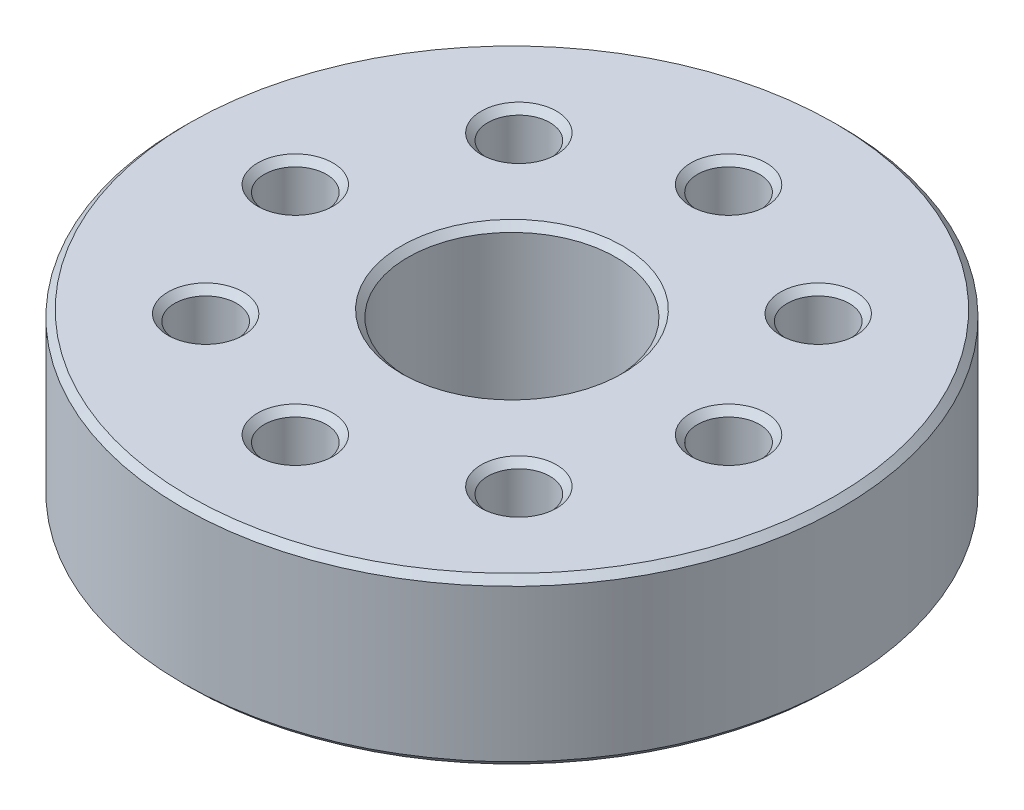
ISO-10303-21;
HEADER;
FILE_DESCRIPTION(('STEP AP214'),'2;1');
FILE_NAME('part.step','',(''),(''),'','','');
FILE_SCHEMA(('AUTOMOTIVE_DESIGN { 1 0 10303 214 1 1 1 1 }'));
ENDSEC;
DATA;
#1=APPLICATION_CONTEXT('core data for automotive mechanical design processes');
#2=APPLICATION_PROTOCOL_DEFINITION('international standard','automotive_design',2000,#1);
#3=PRODUCT_CONTEXT('',#1,'mechanical');
#4=PRODUCT('Part','Part','',(#3));
#5=PRODUCT_RELATED_PRODUCT_CATEGORY('part','',(#4));
#6=PRODUCT_DEFINITION_FORMATION('','',#4);
#7=PRODUCT_DEFINITION_CONTEXT('part definition',#1,'design');
#8=PRODUCT_DEFINITION('design','',#6,#7);
#9=PRODUCT_DEFINITION_SHAPE('','',#8);
#10=(LENGTH_UNIT() NAMED_UNIT(*) SI_UNIT(.MILLI.,.METRE.));
#11=(NAMED_UNIT(*) PLANE_ANGLE_UNIT() SI_UNIT($,.RADIAN.));
#12=(NAMED_UNIT(*) SI_UNIT($,.STERADIAN.) SOLID_ANGLE_UNIT());
#13=UNCERTAINTY_MEASURE_WITH_UNIT(LENGTH_MEASURE(1.E-05),#10,'distance_accuracy_value','');
#14=(GEOMETRIC_REPRESENTATION_CONTEXT(3) GLOBAL_UNCERTAINTY_ASSIGNED_CONTEXT((#13)) GLOBAL_UNIT_ASSIGNED_CONTEXT((#10,
#11,#12)) REPRESENTATION_CONTEXT('',''));
#15=CARTESIAN_POINT('',(0.,0.,0.));
#16=DIRECTION('',(0.,0.,1.));
#17=DIRECTION('',(1.,0.,0.));
#18=AXIS2_PLACEMENT_3D('',#15,#16,#17);
#19=CARTESIAN_POINT('',(0.,6.35,0.));
#20=DIRECTION('',(0.,1.,0.));
#21=DIRECTION('',(0.,0.,1.));
#22=AXIS2_PLACEMENT_3D('',#19,#20,#21);
#23=PLANE('',#22);
#24=CARTESIAN_POINT('',(0.,6.35,0.));
#25=DIRECTION('',(0.,1.,0.));
#26=DIRECTION('',(0.,0.,1.));
#27=AXIS2_PLACEMENT_3D('',#24,#25,#26);
#28=CIRCLE('',#27,4.2545);
#29=CARTESIAN_POINT('',(0.,6.35,4.2545));
#30=VERTEX_POINT('',#29);
#31=EDGE_CURVE('E126',#30,#30,#28,.F.);
#32=ORIENTED_EDGE('',*,*,#31,.T.);
#33=EDGE_LOOP('',(#32));
#34=FACE_BOUND('',#33,.T.);
#35=CARTESIAN_POINT('',(6.02278841453923,6.35,-5.75629335194898));
#36=DIRECTION('',(0.,1.,0.));
#37=DIRECTION('',(0.,0.,1.));
#38=AXIS2_PLACEMENT_3D('',#35,#36,#37);
#39=CIRCLE('',#38,1.4478);
#40=CARTESIAN_POINT('',(6.02278841453923,6.35,-4.30849335194898));
#41=VERTEX_POINT('',#40);
#42=EDGE_CURVE('E129',#41,#41,#39,.F.);
#43=ORIENTED_EDGE('',*,*,#42,.T.);
#44=EDGE_LOOP('',(#43));
#45=FACE_BOUND('',#44,.T.);
#46=CARTESIAN_POINT('',(8.3312,6.35,0.));
#47=DIRECTION('',(0.,1.,0.));
#48=DIRECTION('',(0.,0.,1.));
#49=AXIS2_PLACEMENT_3D('',#46,#47,#48);
#50=CIRCLE('',#49,1.4478);
#51=CARTESIAN_POINT('',(8.3312,6.35,1.4478));
#52=VERTEX_POINT('',#51);
#53=EDGE_CURVE('E132',#52,#52,#50,.F.);
#54=ORIENTED_EDGE('',*,*,#53,.T.);
#55=EDGE_LOOP('',(#54));
#56=FACE_BOUND('',#55,.T.);
#57=CARTESIAN_POINT('',(6.02278841453924,6.35,5.75629335194898));
#58=DIRECTION('',(0.,1.,0.));
#59=DIRECTION('',(0.,0.,1.));
#60=AXIS2_PLACEMENT_3D('',#57,#58,#59);
#61=CIRCLE('',#60,1.4478);
#62=CARTESIAN_POINT('',(6.02278841453924,6.35,7.20409335194897));
#63=VERTEX_POINT('',#62);
#64=EDGE_CURVE('E135',#63,#63,#61,.F.);
#65=ORIENTED_EDGE('',*,*,#64,.T.);
#66=EDGE_LOOP('',(#65));
#67=FACE_BOUND('',#66,.T.);
#68=CARTESIAN_POINT('',(0.,6.35,8.3312));
#69=DIRECTION('',(0.,1.,0.));
#70=DIRECTION('',(0.,0.,1.));
#71=AXIS2_PLACEMENT_3D('',#68,#69,#70);
#72=CIRCLE('',#71,1.4478);
#73=CARTESIAN_POINT('',(0.,6.35,9.779));
#74=VERTEX_POINT('',#73);
#75=EDGE_CURVE('E138',#74,#74,#72,.F.);
#76=ORIENTED_EDGE('',*,*,#75,.T.);
#77=EDGE_LOOP('',(#76));
#78=FACE_BOUND('',#77,.T.);
#79=CARTESIAN_POINT('',(-5.756293351949,6.35,6.02278841453921));
#80=DIRECTION('',(0.,1.,0.));
#81=DIRECTION('',(0.,0.,1.));
#82=AXIS2_PLACEMENT_3D('',#79,#80,#81);
#83=CIRCLE('',#82,1.4478);
#84=CARTESIAN_POINT('',(-5.756293351949,6.35,7.47058841453921));
#85=VERTEX_POINT('',#84);
#86=EDGE_CURVE('E141',#85,#85,#83,.F.);
#87=ORIENTED_EDGE('',*,*,#86,.T.);
#88=EDGE_LOOP('',(#87));
#89=FACE_BOUND('',#88,.T.);
#90=CARTESIAN_POINT('',(-8.3312,6.35,0.));
#91=DIRECTION('',(0.,1.,0.));
#92=DIRECTION('',(0.,0.,1.));
#93=AXIS2_PLACEMENT_3D('',#90,#91,#92);
#94=CIRCLE('',#93,1.4478);
#95=CARTESIAN_POINT('',(-8.3312,6.35,1.4478));
#96=VERTEX_POINT('',#95);
#97=EDGE_CURVE('E144',#96,#96,#94,.F.);
#98=ORIENTED_EDGE('',*,*,#97,.T.);
#99=EDGE_LOOP('',(#98));
#100=FACE_BOUND('',#99,.T.);
#101=CARTESIAN_POINT('',(-5.756293351949,6.35,-6.02278841453921));
#102=DIRECTION('',(0.,1.,0.));
#103=DIRECTION('',(0.,0.,1.));
#104=AXIS2_PLACEMENT_3D('',#101,#102,#103);
#105=CIRCLE('',#104,1.4478);
#106=CARTESIAN_POINT('',(-5.756293351949,6.35,-4.57498841453921));
#107=VERTEX_POINT('',#106);
#108=EDGE_CURVE('E147',#107,#107,#105,.F.);
#109=ORIENTED_EDGE('',*,*,#108,.T.);
#110=EDGE_LOOP('',(#109));
#111=FACE_BOUND('',#110,.T.);
#112=CARTESIAN_POINT('',(0.,6.35,-8.3312));
#113=DIRECTION('',(0.,1.,0.));
#114=DIRECTION('',(0.,0.,1.));
#115=AXIS2_PLACEMENT_3D('',#112,#113,#114);
#116=CIRCLE('',#115,1.4478);
#117=CARTESIAN_POINT('',(0.,6.35,-6.8834));
#118=VERTEX_POINT('',#117);
#119=EDGE_CURVE('E150',#118,#118,#116,.F.);
#120=ORIENTED_EDGE('',*,*,#119,.T.);
#121=EDGE_LOOP('',(#120));
#122=FACE_BOUND('',#121,.T.);
#123=CARTESIAN_POINT('',(0.,6.35,0.));
#124=DIRECTION('',(0.,1.,0.));
#125=DIRECTION('',(0.,0.,1.));
#126=AXIS2_PLACEMENT_3D('',#123,#124,#125);
#127=CIRCLE('',#126,12.4206);
#128=CARTESIAN_POINT('',(0.,6.35,12.4206));
#129=VERTEX_POINT('',#128);
#130=EDGE_CURVE('E153',#129,#129,#127,.T.);
#131=ORIENTED_EDGE('',*,*,#130,.T.);
#132=EDGE_LOOP('',(#131));
#133=FACE_BOUND('',#132,.T.);
#134=ADVANCED_FACE('F34',(#34,#45,#56,#67,#78,#89,#100,#111,#122,#133),#23,.T.);
#135=CARTESIAN_POINT('',(0.,0.,0.));
#136=DIRECTION('',(0.,1.,0.));
#137=DIRECTION('',(0.,0.,1.));
#138=AXIS2_PLACEMENT_3D('',#135,#136,#137);
#139=PLANE('',#138);
#140=CARTESIAN_POINT('',(-8.3312,0.,0.));
#141=DIRECTION('',(0.,1.,0.));
#142=DIRECTION('',(0.,0.,1.));
#143=AXIS2_PLACEMENT_3D('',#140,#141,#142);
#144=CIRCLE('',#143,1.4478);
#145=CARTESIAN_POINT('',(-8.3312,0.,1.4478));
#146=VERTEX_POINT('',#145);
#147=EDGE_CURVE('E10',#146,#146,#144,.T.);
#148=ORIENTED_EDGE('',*,*,#147,.T.);
#149=EDGE_LOOP('',(#148));
#150=FACE_BOUND('',#149,.T.);
#151=CARTESIAN_POINT('',(-5.756293351949,0.,-6.02278841453921));
#152=DIRECTION('',(0.,1.,0.));
#153=DIRECTION('',(0.,0.,1.));
#154=AXIS2_PLACEMENT_3D('',#151,#152,#153);
#155=CIRCLE('',#154,1.4478);
#156=CARTESIAN_POINT('',(-5.756293351949,0.,-4.57498841453921));
#157=VERTEX_POINT('',#156);
#158=EDGE_CURVE('E41',#157,#157,#155,.T.);
#159=ORIENTED_EDGE('',*,*,#158,.T.);
#160=EDGE_LOOP('',(#159));
#161=FACE_BOUND('',#160,.T.);
#162=CARTESIAN_POINT('',(0.,0.,-8.3312));
#163=DIRECTION('',(0.,1.,0.));
#164=DIRECTION('',(0.,0.,1.));
#165=AXIS2_PLACEMENT_3D('',#162,#163,#164);
#166=CIRCLE('',#165,1.44780000000001);
#167=CARTESIAN_POINT('',(0.,0.,-6.88339999999999));
#168=VERTEX_POINT('',#167);
#169=EDGE_CURVE('E45',#168,#168,#166,.T.);
#170=ORIENTED_EDGE('',*,*,#169,.T.);
#171=EDGE_LOOP('',(#170));
#172=FACE_BOUND('',#171,.T.);
#173=CARTESIAN_POINT('',(6.02278841453923,0.,-5.75629335194898));
#174=DIRECTION('',(0.,1.,0.));
#175=DIRECTION('',(0.,0.,1.));
#176=AXIS2_PLACEMENT_3D('',#173,#174,#175);
#177=CIRCLE('',#176,1.4478);
#178=CARTESIAN_POINT('',(6.02278841453923,0.,-4.30849335194898));
#179=VERTEX_POINT('',#178);
#180=EDGE_CURVE('E49',#179,#179,#177,.T.);
#181=ORIENTED_EDGE('',*,*,#180,.T.);
#182=EDGE_LOOP('',(#181));
#183=FACE_BOUND('',#182,.T.);
#184=CARTESIAN_POINT('',(8.3312,0.,0.));
#185=DIRECTION('',(0.,1.,0.));
#186=DIRECTION('',(0.,0.,1.));
#187=AXIS2_PLACEMENT_3D('',#184,#185,#186);
#188=CIRCLE('',#187,1.4478);
#189=CARTESIAN_POINT('',(8.3312,0.,1.4478));
#190=VERTEX_POINT('',#189);
#191=EDGE_CURVE('E54',#190,#190,#188,.T.);
#192=ORIENTED_EDGE('',*,*,#191,.T.);
#193=EDGE_LOOP('',(#192));
#194=FACE_BOUND('',#193,.T.);
#195=CARTESIAN_POINT('',(6.02278841453924,0.,5.75629335194898));
#196=DIRECTION('',(0.,1.,0.));
#197=DIRECTION('',(0.,0.,1.));
#198=AXIS2_PLACEMENT_3D('',#195,#196,#197);
#199=CIRCLE('',#198,1.44779999999999);
#200=CARTESIAN_POINT('',(6.02278841453924,0.,7.20409335194897));
#201=VERTEX_POINT('',#200);
#202=EDGE_CURVE('E57',#201,#201,#199,.T.);
#203=ORIENTED_EDGE('',*,*,#202,.T.);
#204=EDGE_LOOP('',(#203));
#205=FACE_BOUND('',#204,.T.);
#206=CARTESIAN_POINT('',(0.,0.,8.3312));
#207=DIRECTION('',(0.,1.,0.));
#208=DIRECTION('',(0.,0.,1.));
#209=AXIS2_PLACEMENT_3D('',#206,#207,#208);
#210=CIRCLE('',#209,1.4478);
#211=CARTESIAN_POINT('',(0.,0.,9.779));
#212=VERTEX_POINT('',#211);
#213=EDGE_CURVE('E60',#212,#212,#210,.T.);
#214=ORIENTED_EDGE('',*,*,#213,.T.);
#215=EDGE_LOOP('',(#214));
#216=FACE_BOUND('',#215,.T.);
#217=CARTESIAN_POINT('',(-5.756293351949,0.,6.02278841453921));
#218=DIRECTION('',(0.,1.,0.));
#219=DIRECTION('',(0.,0.,1.));
#220=AXIS2_PLACEMENT_3D('',#217,#218,#219);
#221=CIRCLE('',#220,1.4478);
#222=CARTESIAN_POINT('',(-5.756293351949,0.,7.47058841453921));
#223=VERTEX_POINT('',#222);
#224=EDGE_CURVE('E63',#223,#223,#221,.T.);
#225=ORIENTED_EDGE('',*,*,#224,.T.);
#226=EDGE_LOOP('',(#225));
#227=FACE_BOUND('',#226,.T.);
#228=CARTESIAN_POINT('',(0.,0.,0.));
#229=DIRECTION('',(0.,1.,0.));
#230=DIRECTION('',(0.,0.,1.));
#231=AXIS2_PLACEMENT_3D('',#228,#229,#230);
#232=CIRCLE('',#231,12.4206);
#233=CARTESIAN_POINT('',(0.,0.,12.4206));
#234=VERTEX_POINT('',#233);
#235=EDGE_CURVE('E66',#234,#234,#232,.F.);
#236=ORIENTED_EDGE('',*,*,#235,.T.);
#237=EDGE_LOOP('',(#236));
#238=FACE_BOUND('',#237,.T.);
#239=CARTESIAN_POINT('',(0.,0.,0.));
#240=DIRECTION('',(0.,1.,0.));
#241=DIRECTION('',(0.,0.,1.));
#242=AXIS2_PLACEMENT_3D('',#239,#240,#241);
#243=CIRCLE('',#242,4.2545);
#244=CARTESIAN_POINT('',(0.,0.,4.2545));
#245=VERTEX_POINT('',#244);
#246=EDGE_CURVE('E69',#245,#245,#243,.T.);
#247=ORIENTED_EDGE('',*,*,#246,.T.);
#248=EDGE_LOOP('',(#247));
#249=FACE_BOUND('',#248,.T.);
#250=ADVANCED_FACE('F170',(#150,#161,#172,#183,#194,#205,#216,#227,#238,#249),#139,.F.);
#251=CARTESIAN_POINT('',(0.,6.35,0.));
#252=DIRECTION('',(0.,-1.,0.));
#253=DIRECTION('',(0.,0.,-1.));
#254=AXIS2_PLACEMENT_3D('',#251,#252,#253);
#255=CYLINDRICAL_SURFACE('',#254,12.6746);
#256=CARTESIAN_POINT('',(0.,6.09599999999999,0.));
#257=DIRECTION('',(0.,1.,0.));
#258=DIRECTION('',(0.,0.,1.));
#259=AXIS2_PLACEMENT_3D('',#256,#257,#258);
#260=CIRCLE('',#259,12.6746);
#261=CARTESIAN_POINT('',(0.,6.09599999999999,12.6746));
#262=VERTEX_POINT('',#261);
#263=EDGE_CURVE('E72',#262,#262,#260,.F.);
#264=ORIENTED_EDGE('',*,*,#263,.T.);
#265=EDGE_LOOP('',(#264));
#266=FACE_BOUND('',#265,.T.);
#267=CARTESIAN_POINT('',(0.,0.253999999999992,0.));
#268=DIRECTION('',(0.,1.,0.));
#269=DIRECTION('',(0.,0.,1.));
#270=AXIS2_PLACEMENT_3D('',#267,#268,#269);
#271=CIRCLE('',#270,12.6746);
#272=CARTESIAN_POINT('',(0.,0.253999999999992,12.6746));
#273=VERTEX_POINT('',#272);
#274=EDGE_CURVE('E75',#273,#273,#271,.T.);
#275=ORIENTED_EDGE('',*,*,#274,.T.);
#276=EDGE_LOOP('',(#275));
#277=FACE_BOUND('',#276,.T.);
#278=ADVANCED_FACE('F172',(#266,#277),#255,.T.);
#279=CARTESIAN_POINT('',(0.,6.35,0.));
#280=DIRECTION('',(0.,-1.,0.));
#281=DIRECTION('',(0.,0.,-1.));
#282=AXIS2_PLACEMENT_3D('',#279,#280,#281);
#283=CYLINDRICAL_SURFACE('',#282,4.0005);
#284=CARTESIAN_POINT('',(0.,6.096,0.));
#285=DIRECTION('',(0.,1.,0.));
#286=DIRECTION('',(0.,0.,1.));
#287=AXIS2_PLACEMENT_3D('',#284,#285,#286);
#288=CIRCLE('',#287,4.0005);
#289=CARTESIAN_POINT('',(0.,6.096,4.0005));
#290=VERTEX_POINT('',#289);
#291=EDGE_CURVE('E156',#290,#290,#288,.T.);
#292=ORIENTED_EDGE('',*,*,#291,.T.);
#293=EDGE_LOOP('',(#292));
#294=FACE_BOUND('',#293,.T.);
#295=CARTESIAN_POINT('',(0.,0.254000000000003,0.));
#296=DIRECTION('',(0.,1.,0.));
#297=DIRECTION('',(0.,0.,1.));
#298=AXIS2_PLACEMENT_3D('',#295,#296,#297);
#299=CIRCLE('',#298,4.0005);
#300=CARTESIAN_POINT('',(0.,0.254000000000003,4.0005));
#301=VERTEX_POINT('',#300);
#302=EDGE_CURVE('E159',#301,#301,#299,.F.);
#303=ORIENTED_EDGE('',*,*,#302,.T.);
#304=EDGE_LOOP('',(#303));
#305=FACE_BOUND('',#304,.T.);
#306=ADVANCED_FACE('F163',(#294,#305),#283,.F.);
#307=CARTESIAN_POINT('',(0.,6.35,-8.3312));
#308=DIRECTION('',(0.,-1.,0.));
#309=DIRECTION('',(0.,0.,-1.));
#310=AXIS2_PLACEMENT_3D('',#307,#308,#309);
#311=CYLINDRICAL_SURFACE('',#310,1.1938);
#312=CARTESIAN_POINT('',(0.,6.096,-8.3312));
#313=DIRECTION('',(0.,1.,0.));
#314=DIRECTION('',(0.,0.,1.));
#315=AXIS2_PLACEMENT_3D('',#312,#313,#314);
#316=CIRCLE('',#315,1.1938);
#317=CARTESIAN_POINT('',(0.,6.096,-7.1374));
#318=VERTEX_POINT('',#317);
#319=EDGE_CURVE('E78',#318,#318,#316,.T.);
#320=ORIENTED_EDGE('',*,*,#319,.T.);
#321=EDGE_LOOP('',(#320));
#322=FACE_BOUND('',#321,.T.);
#323=CARTESIAN_POINT('',(0.,0.254000000000011,-8.3312));
#324=DIRECTION('',(0.,1.,0.));
#325=DIRECTION('',(0.,0.,1.));
#326=AXIS2_PLACEMENT_3D('',#323,#324,#325);
#327=CIRCLE('',#326,1.1938);
#328=CARTESIAN_POINT('',(0.,0.254000000000011,-7.1374));
#329=VERTEX_POINT('',#328);
#330=EDGE_CURVE('E81',#329,#329,#327,.F.);
#331=ORIENTED_EDGE('',*,*,#330,.T.);
#332=EDGE_LOOP('',(#331));
#333=FACE_BOUND('',#332,.T.);
#334=ADVANCED_FACE('F426',(#322,#333),#311,.F.);
#335=CARTESIAN_POINT('',(8.3312,6.35,0.));
#336=DIRECTION('',(0.,-1.,0.));
#337=DIRECTION('',(0.,0.,-1.));
#338=AXIS2_PLACEMENT_3D('',#335,#336,#337);
#339=CYLINDRICAL_SURFACE('',#338,1.1938);
#340=CARTESIAN_POINT('',(8.3312,6.096,0.));
#341=DIRECTION('',(0.,1.,0.));
#342=DIRECTION('',(0.,0.,1.));
#343=AXIS2_PLACEMENT_3D('',#340,#341,#342);
#344=CIRCLE('',#343,1.1938);
#345=CARTESIAN_POINT('',(8.3312,6.096,1.1938));
#346=VERTEX_POINT('',#345);
#347=EDGE_CURVE('E114',#346,#346,#344,.T.);
#348=ORIENTED_EDGE('',*,*,#347,.T.);
#349=EDGE_LOOP('',(#348));
#350=FACE_BOUND('',#349,.T.);
#351=CARTESIAN_POINT('',(8.3312,0.253999999999999,0.));
#352=DIRECTION('',(0.,1.,0.));
#353=DIRECTION('',(0.,0.,1.));
#354=AXIS2_PLACEMENT_3D('',#351,#352,#353);
#355=CIRCLE('',#354,1.1938);
#356=CARTESIAN_POINT('',(8.3312,0.253999999999999,1.1938));
#357=VERTEX_POINT('',#356);
#358=EDGE_CURVE('E117',#357,#357,#355,.F.);
#359=ORIENTED_EDGE('',*,*,#358,.T.);
#360=EDGE_LOOP('',(#359));
#361=FACE_BOUND('',#360,.T.);
#362=ADVANCED_FACE('F417',(#350,#361),#339,.F.);
#363=CARTESIAN_POINT('',(0.,6.35,8.3312));
#364=DIRECTION('',(0.,-1.,0.));
#365=DIRECTION('',(0.,0.,-1.));
#366=AXIS2_PLACEMENT_3D('',#363,#364,#365);
#367=CYLINDRICAL_SURFACE('',#366,1.1938);
#368=CARTESIAN_POINT('',(0.,6.096,8.3312));
#369=DIRECTION('',(0.,1.,0.));
#370=DIRECTION('',(0.,0.,1.));
#371=AXIS2_PLACEMENT_3D('',#368,#369,#370);
#372=CIRCLE('',#371,1.1938);
#373=CARTESIAN_POINT('',(0.,6.096,9.525));
#374=VERTEX_POINT('',#373);
#375=EDGE_CURVE('E102',#374,#374,#372,.T.);
#376=ORIENTED_EDGE('',*,*,#375,.T.);
#377=EDGE_LOOP('',(#376));
#378=FACE_BOUND('',#377,.T.);
#379=CARTESIAN_POINT('',(0.,0.253999999999999,8.3312));
#380=DIRECTION('',(0.,1.,0.));
#381=DIRECTION('',(0.,0.,1.));
#382=AXIS2_PLACEMENT_3D('',#379,#380,#381);
#383=CIRCLE('',#382,1.1938);
#384=CARTESIAN_POINT('',(0.,0.253999999999999,9.525));
#385=VERTEX_POINT('',#384);
#386=EDGE_CURVE('E105',#385,#385,#383,.F.);
#387=ORIENTED_EDGE('',*,*,#386,.T.);
#388=EDGE_LOOP('',(#387));
#389=FACE_BOUND('',#388,.T.);
#390=ADVANCED_FACE('F408',(#378,#389),#367,.F.);
#391=CARTESIAN_POINT('',(-8.3312,6.35,0.));
#392=DIRECTION('',(0.,-1.,0.));
#393=DIRECTION('',(0.,0.,-1.));
#394=AXIS2_PLACEMENT_3D('',#391,#392,#393);
#395=CYLINDRICAL_SURFACE('',#394,1.1938);
#396=CARTESIAN_POINT('',(-8.3312,6.096,0.));
#397=DIRECTION('',(0.,1.,0.));
#398=DIRECTION('',(0.,0.,1.));
#399=AXIS2_PLACEMENT_3D('',#396,#397,#398);
#400=CIRCLE('',#399,1.1938);
#401=CARTESIAN_POINT('',(-8.3312,6.096,1.1938));
#402=VERTEX_POINT('',#401);
#403=EDGE_CURVE('E90',#402,#402,#400,.T.);
#404=ORIENTED_EDGE('',*,*,#403,.T.);
#405=EDGE_LOOP('',(#404));
#406=FACE_BOUND('',#405,.T.);
#407=CARTESIAN_POINT('',(-8.3312,0.253999999999999,0.));
#408=DIRECTION('',(0.,1.,0.));
#409=DIRECTION('',(0.,0.,1.));
#410=AXIS2_PLACEMENT_3D('',#407,#408,#409);
#411=CIRCLE('',#410,1.1938);
#412=CARTESIAN_POINT('',(-8.3312,0.253999999999999,1.1938));
#413=VERTEX_POINT('',#412);
#414=EDGE_CURVE('E93',#413,#413,#411,.F.);
#415=ORIENTED_EDGE('',*,*,#414,.T.);
#416=EDGE_LOOP('',(#415));
#417=FACE_BOUND('',#416,.T.);
#418=ADVANCED_FACE('F399',(#406,#417),#395,.F.);
#419=CARTESIAN_POINT('',(-5.756293351949,6.35,-6.02278841453921));
#420=DIRECTION('',(0.,-1.,0.));
#421=DIRECTION('',(0.,0.,-1.));
#422=AXIS2_PLACEMENT_3D('',#419,#420,#421);
#423=CYLINDRICAL_SURFACE('',#422,1.1938);
#424=CARTESIAN_POINT('',(-5.756293351949,6.096,-6.02278841453921));
#425=DIRECTION('',(0.,1.,0.));
#426=DIRECTION('',(0.,0.,1.));
#427=AXIS2_PLACEMENT_3D('',#424,#425,#426);
#428=CIRCLE('',#427,1.1938);
#429=CARTESIAN_POINT('',(-5.756293351949,6.096,-4.82898841453921));
#430=VERTEX_POINT('',#429);
#431=EDGE_CURVE('E84',#430,#430,#428,.T.);
#432=ORIENTED_EDGE('',*,*,#431,.T.);
#433=EDGE_LOOP('',(#432));
#434=FACE_BOUND('',#433,.T.);
#435=CARTESIAN_POINT('',(-5.756293351949,0.253999999999999,-6.02278841453921));
#436=DIRECTION('',(0.,1.,0.));
#437=DIRECTION('',(0.,0.,1.));
#438=AXIS2_PLACEMENT_3D('',#435,#436,#437);
#439=CIRCLE('',#438,1.1938);
#440=CARTESIAN_POINT('',(-5.756293351949,0.253999999999999,-4.82898841453921));
#441=VERTEX_POINT('',#440);
#442=EDGE_CURVE('E87',#441,#441,#439,.F.);
#443=ORIENTED_EDGE('',*,*,#442,.T.);
#444=EDGE_LOOP('',(#443));
#445=FACE_BOUND('',#444,.T.);
#446=ADVANCED_FACE('F390',(#434,#445),#423,.F.);
#447=CARTESIAN_POINT('',(6.02278841453923,6.35,-5.75629335194898));
#448=DIRECTION('',(0.,-1.,0.));
#449=DIRECTION('',(0.,0.,-1.));
#450=AXIS2_PLACEMENT_3D('',#447,#448,#449);
#451=CYLINDRICAL_SURFACE('',#450,1.1938);
#452=CARTESIAN_POINT('',(6.02278841453923,6.096,-5.75629335194898));
#453=DIRECTION('',(0.,1.,0.));
#454=DIRECTION('',(0.,0.,1.));
#455=AXIS2_PLACEMENT_3D('',#452,#453,#454);
#456=CIRCLE('',#455,1.1938);
#457=CARTESIAN_POINT('',(6.02278841453923,6.096,-4.56249335194898));
#458=VERTEX_POINT('',#457);
#459=EDGE_CURVE('E120',#458,#458,#456,.T.);
#460=ORIENTED_EDGE('',*,*,#459,.T.);
#461=EDGE_LOOP('',(#460));
#462=FACE_BOUND('',#461,.T.);
#463=CARTESIAN_POINT('',(6.02278841453923,0.253999999999999,-5.75629335194898));
#464=DIRECTION('',(0.,1.,0.));
#465=DIRECTION('',(0.,0.,1.));
#466=AXIS2_PLACEMENT_3D('',#463,#464,#465);
#467=CIRCLE('',#466,1.1938);
#468=CARTESIAN_POINT('',(6.02278841453923,0.253999999999999,-4.56249335194898));
#469=VERTEX_POINT('',#468);
#470=EDGE_CURVE('E123',#469,#469,#467,.F.);
#471=ORIENTED_EDGE('',*,*,#470,.T.);
#472=EDGE_LOOP('',(#471));
#473=FACE_BOUND('',#472,.T.);
#474=ADVANCED_FACE('F381',(#462,#473),#451,.F.);
#475=CARTESIAN_POINT('',(6.02278841453924,6.35,5.75629335194898));
#476=DIRECTION('',(0.,-1.,0.));
#477=DIRECTION('',(0.,0.,-1.));
#478=AXIS2_PLACEMENT_3D('',#475,#476,#477);
#479=CYLINDRICAL_SURFACE('',#478,1.1938);
#480=CARTESIAN_POINT('',(6.02278841453924,6.096,5.75629335194898));
#481=DIRECTION('',(0.,1.,0.));
#482=DIRECTION('',(0.,0.,1.));
#483=AXIS2_PLACEMENT_3D('',#480,#481,#482);
#484=CIRCLE('',#483,1.1938);
#485=CARTESIAN_POINT('',(6.02278841453924,6.096,6.95009335194897));
#486=VERTEX_POINT('',#485);
#487=EDGE_CURVE('E108',#486,#486,#484,.T.);
#488=ORIENTED_EDGE('',*,*,#487,.T.);
#489=EDGE_LOOP('',(#488));
#490=FACE_BOUND('',#489,.T.);
#491=CARTESIAN_POINT('',(6.02278841453924,0.253999999999996,5.75629335194898));
#492=DIRECTION('',(0.,1.,0.));
#493=DIRECTION('',(0.,0.,1.));
#494=AXIS2_PLACEMENT_3D('',#491,#492,#493);
#495=CIRCLE('',#494,1.1938);
#496=CARTESIAN_POINT('',(6.02278841453924,0.253999999999996,6.95009335194897));
#497=VERTEX_POINT('',#496);
#498=EDGE_CURVE('E111',#497,#497,#495,.F.);
#499=ORIENTED_EDGE('',*,*,#498,.T.);
#500=EDGE_LOOP('',(#499));
#501=FACE_BOUND('',#500,.T.);
#502=ADVANCED_FACE('F372',(#490,#501),#479,.F.);
#503=CARTESIAN_POINT('',(-5.756293351949,6.35,6.02278841453921));
#504=DIRECTION('',(0.,-1.,0.));
#505=DIRECTION('',(0.,0.,-1.));
#506=AXIS2_PLACEMENT_3D('',#503,#504,#505);
#507=CYLINDRICAL_SURFACE('',#506,1.1938);
#508=CARTESIAN_POINT('',(-5.756293351949,6.096,6.02278841453921));
#509=DIRECTION('',(0.,1.,0.));
#510=DIRECTION('',(0.,0.,1.));
#511=AXIS2_PLACEMENT_3D('',#508,#509,#510);
#512=CIRCLE('',#511,1.1938);
#513=CARTESIAN_POINT('',(-5.756293351949,6.096,7.21658841453921));
#514=VERTEX_POINT('',#513);
#515=EDGE_CURVE('E96',#514,#514,#512,.T.);
#516=ORIENTED_EDGE('',*,*,#515,.T.);
#517=EDGE_LOOP('',(#516));
#518=FACE_BOUND('',#517,.T.);
#519=CARTESIAN_POINT('',(-5.756293351949,0.253999999999999,6.02278841453921));
#520=DIRECTION('',(0.,1.,0.));
#521=DIRECTION('',(0.,0.,1.));
#522=AXIS2_PLACEMENT_3D('',#519,#520,#521);
#523=CIRCLE('',#522,1.1938);
#524=CARTESIAN_POINT('',(-5.756293351949,0.253999999999999,7.21658841453921));
#525=VERTEX_POINT('',#524);
#526=EDGE_CURVE('E99',#525,#525,#523,.F.);
#527=ORIENTED_EDGE('',*,*,#526,.T.);
#528=EDGE_LOOP('',(#527));
#529=FACE_BOUND('',#528,.T.);
#530=ADVANCED_FACE('F188',(#518,#529),#507,.F.);
#531=CARTESIAN_POINT('',(0.,6.096,0.));
#532=DIRECTION('',(0.,1.,0.));
#533=DIRECTION('',(0.,0.,1.));
#534=AXIS2_PLACEMENT_3D('',#531,#532,#533);
#535=CONICAL_SURFACE('',#534,4.0005,0.78539816339745);
#536=ORIENTED_EDGE('',*,*,#31,.F.);
#537=EDGE_LOOP('',(#536));
#538=FACE_BOUND('',#537,.T.);
#539=ORIENTED_EDGE('',*,*,#291,.F.);
#540=EDGE_LOOP('',(#539));
#541=FACE_BOUND('',#540,.T.);
#542=ADVANCED_FACE('F184',(#538,#541),#535,.F.);
#543=CARTESIAN_POINT('',(6.02278841453923,6.096,-5.75629335194898));
#544=DIRECTION('',(0.,1.,0.));
#545=DIRECTION('',(0.,0.,1.));
#546=AXIS2_PLACEMENT_3D('',#543,#544,#545);
#547=CONICAL_SURFACE('',#546,1.1938,0.785398163397455);
#548=ORIENTED_EDGE('',*,*,#42,.F.);
#549=EDGE_LOOP('',(#548));
#550=FACE_BOUND('',#549,.T.);
#551=ORIENTED_EDGE('',*,*,#459,.F.);
#552=EDGE_LOOP('',(#551));
#553=FACE_BOUND('',#552,.T.);
#554=ADVANCED_FACE('F187',(#550,#553),#547,.F.);
#555=CARTESIAN_POINT('',(8.3312,6.096,0.));
#556=DIRECTION('',(0.,1.,0.));
#557=DIRECTION('',(0.,0.,1.));
#558=AXIS2_PLACEMENT_3D('',#555,#556,#557);
#559=CONICAL_SURFACE('',#558,1.1938,0.785398163397454);
#560=ORIENTED_EDGE('',*,*,#53,.F.);
#561=EDGE_LOOP('',(#560));
#562=FACE_BOUND('',#561,.T.);
#563=ORIENTED_EDGE('',*,*,#347,.F.);
#564=EDGE_LOOP('',(#563));
#565=FACE_BOUND('',#564,.T.);
#566=ADVANCED_FACE('F192',(#562,#565),#559,.F.);
#567=CARTESIAN_POINT('',(6.02278841453924,6.096,5.75629335194898));
#568=DIRECTION('',(0.,1.,0.));
#569=DIRECTION('',(0.,0.,1.));
#570=AXIS2_PLACEMENT_3D('',#567,#568,#569);
#571=CONICAL_SURFACE('',#570,1.1938,0.785398163397455);
#572=ORIENTED_EDGE('',*,*,#64,.F.);
#573=EDGE_LOOP('',(#572));
#574=FACE_BOUND('',#573,.T.);
#575=ORIENTED_EDGE('',*,*,#487,.F.);
#576=EDGE_LOOP('',(#575));
#577=FACE_BOUND('',#576,.T.);
#578=ADVANCED_FACE('F196',(#574,#577),#571,.F.);
#579=CARTESIAN_POINT('',(0.,6.096,8.3312));
#580=DIRECTION('',(0.,1.,0.));
#581=DIRECTION('',(0.,0.,1.));
#582=AXIS2_PLACEMENT_3D('',#579,#580,#581);
#583=CONICAL_SURFACE('',#582,1.1938,0.785398163397455);
#584=ORIENTED_EDGE('',*,*,#75,.F.);
#585=EDGE_LOOP('',(#584));
#586=FACE_BOUND('',#585,.T.);
#587=ORIENTED_EDGE('',*,*,#375,.F.);
#588=EDGE_LOOP('',(#587));
#589=FACE_BOUND('',#588,.T.);
#590=ADVANCED_FACE('F200',(#586,#589),#583,.F.);
#591=CARTESIAN_POINT('',(-5.756293351949,6.096,6.02278841453921));
#592=DIRECTION('',(0.,1.,0.));
#593=DIRECTION('',(0.,0.,1.));
#594=AXIS2_PLACEMENT_3D('',#591,#592,#593);
#595=CONICAL_SURFACE('',#594,1.1938,0.785398163397455);
#596=ORIENTED_EDGE('',*,*,#86,.F.);
#597=EDGE_LOOP('',(#596));
#598=FACE_BOUND('',#597,.T.);
#599=ORIENTED_EDGE('',*,*,#515,.F.);
#600=EDGE_LOOP('',(#599));
#601=FACE_BOUND('',#600,.T.);
#602=ADVANCED_FACE('F204',(#598,#601),#595,.F.);
#603=CARTESIAN_POINT('',(-8.3312,6.096,0.));
#604=DIRECTION('',(0.,1.,0.));
#605=DIRECTION('',(0.,0.,1.));
#606=AXIS2_PLACEMENT_3D('',#603,#604,#605);
#607=CONICAL_SURFACE('',#606,1.1938,0.785398163397454);
#608=ORIENTED_EDGE('',*,*,#97,.F.);
#609=EDGE_LOOP('',(#608));
#610=FACE_BOUND('',#609,.T.);
#611=ORIENTED_EDGE('',*,*,#403,.F.);
#612=EDGE_LOOP('',(#611));
#613=FACE_BOUND('',#612,.T.);
#614=ADVANCED_FACE('F208',(#610,#613),#607,.F.);
#615=CARTESIAN_POINT('',(-5.756293351949,6.096,-6.02278841453921));
#616=DIRECTION('',(0.,1.,0.));
#617=DIRECTION('',(0.,0.,1.));
#618=AXIS2_PLACEMENT_3D('',#615,#616,#617);
#619=CONICAL_SURFACE('',#618,1.1938,0.785398163397455);
#620=ORIENTED_EDGE('',*,*,#108,.F.);
#621=EDGE_LOOP('',(#620));
#622=FACE_BOUND('',#621,.T.);
#623=ORIENTED_EDGE('',*,*,#431,.F.);
#624=EDGE_LOOP('',(#623));
#625=FACE_BOUND('',#624,.T.);
#626=ADVANCED_FACE('F212',(#622,#625),#619,.F.);
#627=CARTESIAN_POINT('',(0.,6.096,-8.3312));
#628=DIRECTION('',(0.,1.,0.));
#629=DIRECTION('',(0.,0.,1.));
#630=AXIS2_PLACEMENT_3D('',#627,#628,#629);
#631=CONICAL_SURFACE('',#630,1.1938,0.785398163397455);
#632=ORIENTED_EDGE('',*,*,#119,.F.);
#633=EDGE_LOOP('',(#632));
#634=FACE_BOUND('',#633,.T.);
#635=ORIENTED_EDGE('',*,*,#319,.F.);
#636=EDGE_LOOP('',(#635));
#637=FACE_BOUND('',#636,.T.);
#638=ADVANCED_FACE('F216',(#634,#637),#631,.F.);
#639=CARTESIAN_POINT('',(0.,6.35,0.));
#640=DIRECTION('',(0.,-1.,0.));
#641=DIRECTION('',(0.,0.,-1.));
#642=AXIS2_PLACEMENT_3D('',#639,#640,#641);
#643=CONICAL_SURFACE('',#642,12.4206,0.785398163397448);
#644=ORIENTED_EDGE('',*,*,#263,.F.);
#645=EDGE_LOOP('',(#644));
#646=FACE_BOUND('',#645,.T.);
#647=ORIENTED_EDGE('',*,*,#130,.F.);
#648=EDGE_LOOP('',(#647));
#649=FACE_BOUND('',#648,.T.);
#650=ADVANCED_FACE('F220',(#646,#649),#643,.T.);
#651=CARTESIAN_POINT('',(-8.3312,0.,0.));
#652=DIRECTION('',(0.,-1.,0.));
#653=DIRECTION('',(0.,0.,-1.));
#654=AXIS2_PLACEMENT_3D('',#651,#652,#653);
#655=CONICAL_SURFACE('',#654,1.4478,0.785398163397449);
#656=ORIENTED_EDGE('',*,*,#414,.F.);
#657=EDGE_LOOP('',(#656));
#658=FACE_BOUND('',#657,.T.);
#659=ORIENTED_EDGE('',*,*,#147,.F.);
#660=EDGE_LOOP('',(#659));
#661=FACE_BOUND('',#660,.T.);
#662=ADVANCED_FACE('F224',(#658,#661),#655,.F.);
#663=CARTESIAN_POINT('',(-5.756293351949,0.,-6.02278841453921));
#664=DIRECTION('',(0.,-1.,0.));
#665=DIRECTION('',(0.,0.,-1.));
#666=AXIS2_PLACEMENT_3D('',#663,#664,#665);
#667=CONICAL_SURFACE('',#666,1.4478,0.78539816339745);
#668=ORIENTED_EDGE('',*,*,#442,.F.);
#669=EDGE_LOOP('',(#668));
#670=FACE_BOUND('',#669,.T.);
#671=ORIENTED_EDGE('',*,*,#158,.F.);
#672=EDGE_LOOP('',(#671));
#673=FACE_BOUND('',#672,.T.);
#674=ADVANCED_FACE('F228',(#670,#673),#667,.F.);
#675=CARTESIAN_POINT('',(0.,0.,-8.3312));
#676=DIRECTION('',(0.,-1.,0.));
#677=DIRECTION('',(0.,0.,-1.));
#678=AXIS2_PLACEMENT_3D('',#675,#676,#677);
#679=CONICAL_SURFACE('',#678,1.44780000000001,0.785398163397445);
#680=ORIENTED_EDGE('',*,*,#330,.F.);
#681=EDGE_LOOP('',(#680));
#682=FACE_BOUND('',#681,.T.);
#683=ORIENTED_EDGE('',*,*,#169,.F.);
#684=EDGE_LOOP('',(#683));
#685=FACE_BOUND('',#684,.T.);
#686=ADVANCED_FACE('F232',(#682,#685),#679,.F.);
#687=CARTESIAN_POINT('',(6.02278841453923,0.,-5.75629335194898));
#688=DIRECTION('',(0.,-1.,0.));
#689=DIRECTION('',(0.,0.,-1.));
#690=AXIS2_PLACEMENT_3D('',#687,#688,#689);
#691=CONICAL_SURFACE('',#690,1.4478,0.78539816339745);
#692=ORIENTED_EDGE('',*,*,#470,.F.);
#693=EDGE_LOOP('',(#692));
#694=FACE_BOUND('',#693,.T.);
#695=ORIENTED_EDGE('',*,*,#180,.F.);
#696=EDGE_LOOP('',(#695));
#697=FACE_BOUND('',#696,.T.);
#698=ADVANCED_FACE('F236',(#694,#697),#691,.F.);
#699=CARTESIAN_POINT('',(8.3312,0.,0.));
#700=DIRECTION('',(0.,-1.,0.));
#701=DIRECTION('',(0.,0.,-1.));
#702=AXIS2_PLACEMENT_3D('',#699,#700,#701);
#703=CONICAL_SURFACE('',#702,1.4478,0.785398163397449);
#704=ORIENTED_EDGE('',*,*,#358,.F.);
#705=EDGE_LOOP('',(#704));
#706=FACE_BOUND('',#705,.T.);
#707=ORIENTED_EDGE('',*,*,#191,.F.);
#708=EDGE_LOOP('',(#707));
#709=FACE_BOUND('',#708,.T.);
#710=ADVANCED_FACE('F240',(#706,#709),#703,.F.);
#711=CARTESIAN_POINT('',(6.02278841453924,0.,5.75629335194898));
#712=DIRECTION('',(0.,-1.,0.));
#713=DIRECTION('',(0.,0.,-1.));
#714=AXIS2_PLACEMENT_3D('',#711,#712,#713);
#715=CONICAL_SURFACE('',#714,1.44779999999999,0.785398163397443);
#716=ORIENTED_EDGE('',*,*,#498,.F.);
#717=EDGE_LOOP('',(#716));
#718=FACE_BOUND('',#717,.T.);
#719=ORIENTED_EDGE('',*,*,#202,.F.);
#720=EDGE_LOOP('',(#719));
#721=FACE_BOUND('',#720,.T.);
#722=ADVANCED_FACE('F244',(#718,#721),#715,.F.);
#723=CARTESIAN_POINT('',(0.,0.,8.3312));
#724=DIRECTION('',(0.,-1.,0.));
#725=DIRECTION('',(0.,0.,-1.));
#726=AXIS2_PLACEMENT_3D('',#723,#724,#725);
#727=CONICAL_SURFACE('',#726,1.4478,0.785398163397448);
#728=ORIENTED_EDGE('',*,*,#386,.F.);
#729=EDGE_LOOP('',(#728));
#730=FACE_BOUND('',#729,.T.);
#731=ORIENTED_EDGE('',*,*,#213,.F.);
#732=EDGE_LOOP('',(#731));
#733=FACE_BOUND('',#732,.T.);
#734=ADVANCED_FACE('F248',(#730,#733),#727,.F.);
#735=CARTESIAN_POINT('',(-5.756293351949,0.,6.02278841453921));
#736=DIRECTION('',(0.,-1.,0.));
#737=DIRECTION('',(0.,0.,-1.));
#738=AXIS2_PLACEMENT_3D('',#735,#736,#737);
#739=CONICAL_SURFACE('',#738,1.4478,0.78539816339745);
#740=ORIENTED_EDGE('',*,*,#526,.F.);
#741=EDGE_LOOP('',(#740));
#742=FACE_BOUND('',#741,.T.);
#743=ORIENTED_EDGE('',*,*,#224,.F.);
#744=EDGE_LOOP('',(#743));
#745=FACE_BOUND('',#744,.T.);
#746=ADVANCED_FACE('F252',(#742,#745),#739,.F.);
#747=CARTESIAN_POINT('',(0.,0.253999999999992,0.));
#748=DIRECTION('',(0.,1.,0.));
#749=DIRECTION('',(0.,0.,1.));
#750=AXIS2_PLACEMENT_3D('',#747,#748,#749);
#751=CONICAL_SURFACE('',#750,12.6746,0.785398163397452);
#752=ORIENTED_EDGE('',*,*,#235,.F.);
#753=EDGE_LOOP('',(#752));
#754=FACE_BOUND('',#753,.T.);
#755=ORIENTED_EDGE('',*,*,#274,.F.);
#756=EDGE_LOOP('',(#755));
#757=FACE_BOUND('',#756,.T.);
#758=ADVANCED_FACE('F167',(#754,#757),#751,.T.);
#759=CARTESIAN_POINT('',(0.,0.,0.));
#760=DIRECTION('',(0.,-1.,0.));
#761=DIRECTION('',(0.,0.,-1.));
#762=AXIS2_PLACEMENT_3D('',#759,#760,#761);
#763=CONICAL_SURFACE('',#762,4.2545,0.78539816339744);
#764=ORIENTED_EDGE('',*,*,#302,.F.);
#765=EDGE_LOOP('',(#764));
#766=FACE_BOUND('',#765,.T.);
#767=ORIENTED_EDGE('',*,*,#246,.F.);
#768=EDGE_LOOP('',(#767));
#769=FACE_BOUND('',#768,.T.);
#770=ADVANCED_FACE('F36',(#766,#769),#763,.F.);
#771=CLOSED_SHELL('',(#134,#250,#278,#306,#334,#362,#390,#418,#446,#474,#502,#530,#542,#554,
#566,#578,#590,#602,#614,#626,#638,#650,#662,#674,#686,#698,#710,#722,#734,#746,#758,#770));
#772=MANIFOLD_SOLID_BREP('B2',#771);
#773=ADVANCED_BREP_SHAPE_REPRESENTATION('',(#18,#772),#14);
#774=SHAPE_DEFINITION_REPRESENTATION(#9,#773);
ENDSEC;
END-ISO-10303-21;
